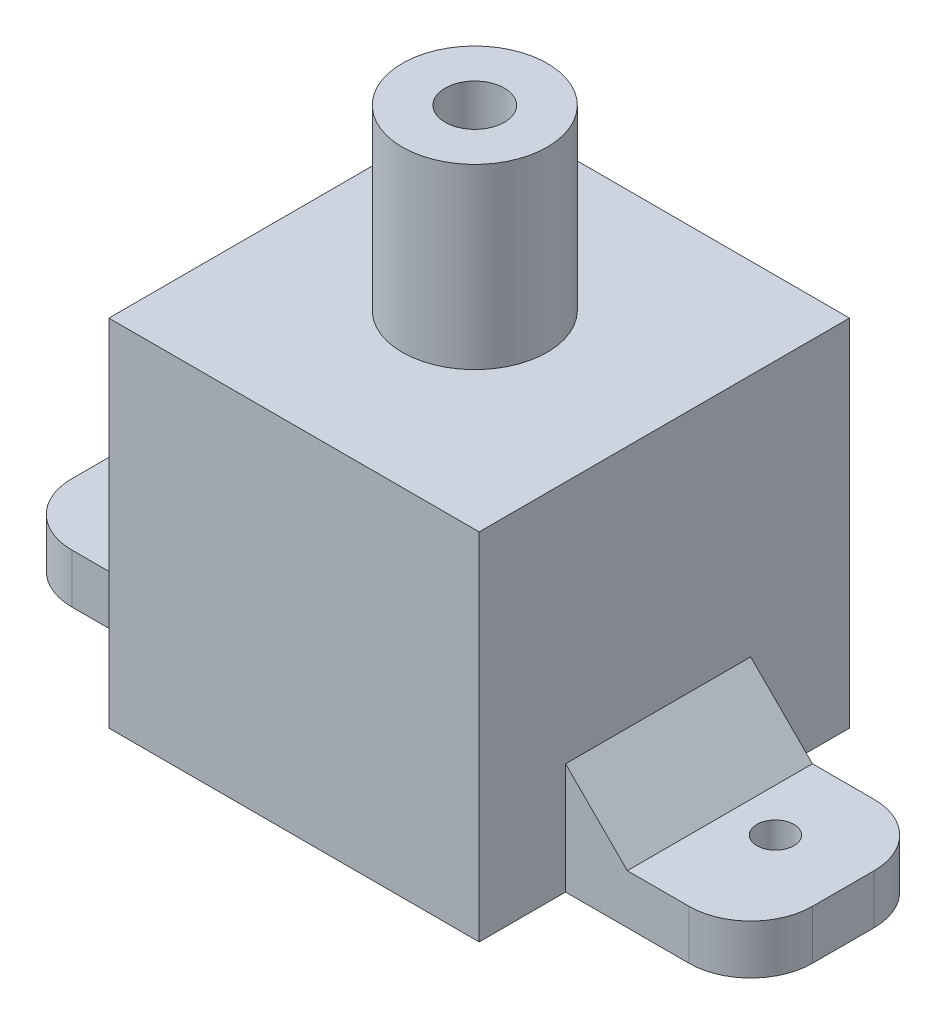
ISO-10303-21;
HEADER;
FILE_DESCRIPTION(('STEP AP214'),'2;1');
FILE_NAME('part.step','',(''),(''),'','','');
FILE_SCHEMA(('AUTOMOTIVE_DESIGN { 1 0 10303 214 1 1 1 1 }'));
ENDSEC;
DATA;
#1=APPLICATION_CONTEXT('core data for automotive mechanical design processes');
#2=APPLICATION_PROTOCOL_DEFINITION('international standard','automotive_design',2000,#1);
#3=PRODUCT_CONTEXT('',#1,'mechanical');
#4=PRODUCT('Part','Part','',(#3));
#5=PRODUCT_RELATED_PRODUCT_CATEGORY('part','',(#4));
#6=PRODUCT_DEFINITION_FORMATION('','',#4);
#7=PRODUCT_DEFINITION_CONTEXT('part definition',#1,'design');
#8=PRODUCT_DEFINITION('design','',#6,#7);
#9=PRODUCT_DEFINITION_SHAPE('','',#8);
#10=(LENGTH_UNIT() NAMED_UNIT(*) SI_UNIT(.MILLI.,.METRE.));
#11=(NAMED_UNIT(*) PLANE_ANGLE_UNIT() SI_UNIT($,.RADIAN.));
#12=(NAMED_UNIT(*) SI_UNIT($,.STERADIAN.) SOLID_ANGLE_UNIT());
#13=UNCERTAINTY_MEASURE_WITH_UNIT(LENGTH_MEASURE(1.E-05),#10,'distance_accuracy_value','');
#14=(GEOMETRIC_REPRESENTATION_CONTEXT(3) GLOBAL_UNCERTAINTY_ASSIGNED_CONTEXT((#13)) GLOBAL_UNIT_ASSIGNED_CONTEXT((#10,
#11,#12)) REPRESENTATION_CONTEXT('',''));
#15=CARTESIAN_POINT('',(0.,0.,0.));
#16=DIRECTION('',(0.,0.,1.));
#17=DIRECTION('',(1.,0.,0.));
#18=AXIS2_PLACEMENT_3D('',#15,#16,#17);
#19=CARTESIAN_POINT('',(-14.2865305436927,28.77,-14.6432652718463));
#20=DIRECTION('',(1.,0.,0.));
#21=DIRECTION('',(0.,0.,-1.));
#22=AXIS2_PLACEMENT_3D('',#19,#20,#21);
#23=PLANE('',#22);
#24=DIRECTION('',(0.,0.,1.));
#25=VECTOR('',#24,1.);
#26=CARTESIAN_POINT('',(-14.2865305436927,9.00000000000004,-14.6432652718463));
#27=LINE('',#26,#25);
#28=CARTESIAN_POINT('',(-14.2865305436927,9.00000000000004,-6.64326527184634));
#29=VERTEX_POINT('',#28);
#30=CARTESIAN_POINT('',(-14.2865305436927,9.00000000000004,8.35673472815366));
#31=VERTEX_POINT('',#30);
#32=EDGE_CURVE('E378',#29,#31,#27,.T.);
#33=ORIENTED_EDGE('',*,*,#32,.T.);
#34=DIRECTION('',(0.,-1.,0.));
#35=VECTOR('',#34,1.);
#36=CARTESIAN_POINT('',(-14.2865305436927,4.,8.35673472815366));
#37=LINE('',#36,#35);
#38=CARTESIAN_POINT('',(-14.2865305436927,0.,8.35673472815366));
#39=VERTEX_POINT('',#38);
#40=EDGE_CURVE('E248',#31,#39,#37,.T.);
#41=ORIENTED_EDGE('',*,*,#40,.T.);
#42=DIRECTION('',(0.,0.,1.));
#43=VECTOR('',#42,1.);
#44=CARTESIAN_POINT('',(-14.2865305436927,0.,-14.6432652718463));
#45=LINE('',#44,#43);
#46=CARTESIAN_POINT('',(-14.2865305436927,0.,15.3567347281537));
#47=VERTEX_POINT('',#46);
#48=EDGE_CURVE('E308',#39,#47,#45,.T.);
#49=ORIENTED_EDGE('',*,*,#48,.T.);
#50=DIRECTION('',(0.,-1.,0.));
#51=VECTOR('',#50,1.);
#52=CARTESIAN_POINT('',(-14.2865305436927,28.77,15.3567347281537));
#53=LINE('',#52,#51);
#54=CARTESIAN_POINT('',(-14.2865305436927,28.77,15.3567347281537));
#55=VERTEX_POINT('',#54);
#56=EDGE_CURVE('E314',#55,#47,#53,.T.);
#57=ORIENTED_EDGE('',*,*,#56,.F.);
#58=DIRECTION('',(0.,0.,1.));
#59=VECTOR('',#58,1.);
#60=CARTESIAN_POINT('',(-14.2865305436927,28.77,-14.6432652718463));
#61=LINE('',#60,#59);
#62=CARTESIAN_POINT('',(-14.2865305436927,28.77,-14.6432652718463));
#63=VERTEX_POINT('',#62);
#64=EDGE_CURVE('E315',#63,#55,#61,.T.);
#65=ORIENTED_EDGE('',*,*,#64,.F.);
#66=DIRECTION('',(0.,-1.,0.));
#67=VECTOR('',#66,1.);
#68=CARTESIAN_POINT('',(-14.2865305436927,28.77,-14.6432652718463));
#69=LINE('',#68,#67);
#70=CARTESIAN_POINT('',(-14.2865305436927,0.,-14.6432652718463));
#71=VERTEX_POINT('',#70);
#72=EDGE_CURVE('E329',#63,#71,#69,.T.);
#73=ORIENTED_EDGE('',*,*,#72,.T.);
#74=CARTESIAN_POINT('',(-14.2865305436927,0.,-6.64326527184634));
#75=VERTEX_POINT('',#74);
#76=EDGE_CURVE('E330',#71,#75,#45,.T.);
#77=ORIENTED_EDGE('',*,*,#76,.T.);
#78=DIRECTION('',(0.,-1.,0.));
#79=VECTOR('',#78,1.);
#80=CARTESIAN_POINT('',(-14.2865305436927,4.,-6.64326527184634));
#81=LINE('',#80,#79);
#82=EDGE_CURVE('E265',#29,#75,#81,.T.);
#83=ORIENTED_EDGE('',*,*,#82,.F.);
#84=EDGE_LOOP('',(#33,#41,#49,#57,#65,#73,#77,#83));
#85=FACE_BOUND('',#84,.T.);
#86=ADVANCED_FACE('F47',(#85),#23,.F.);
#87=CARTESIAN_POINT('',(15.7134694563073,28.77,-14.6432652718463));
#88=DIRECTION('',(-1.,0.,0.));
#89=DIRECTION('',(0.,0.,1.));
#90=AXIS2_PLACEMENT_3D('',#87,#88,#89);
#91=PLANE('',#90);
#92=DIRECTION('',(0.,0.,-1.));
#93=VECTOR('',#92,1.);
#94=CARTESIAN_POINT('',(15.7134694563073,9.00000000000004,-14.6432652718463));
#95=LINE('',#94,#93);
#96=CARTESIAN_POINT('',(15.7134694563073,9.00000000000004,8.35673472815366));
#97=VERTEX_POINT('',#96);
#98=CARTESIAN_POINT('',(15.7134694563073,9.00000000000004,-6.64326527184634));
#99=VERTEX_POINT('',#98);
#100=EDGE_CURVE('E313',#97,#99,#95,.T.);
#101=ORIENTED_EDGE('',*,*,#100,.T.);
#102=DIRECTION('',(0.,-1.,0.));
#103=VECTOR('',#102,1.);
#104=CARTESIAN_POINT('',(15.7134694563073,4.,-6.64326527184634));
#105=LINE('',#104,#103);
#106=CARTESIAN_POINT('',(15.7134694563073,0.,-6.64326527184634));
#107=VERTEX_POINT('',#106);
#108=EDGE_CURVE('E195',#99,#107,#105,.T.);
#109=ORIENTED_EDGE('',*,*,#108,.T.);
#110=DIRECTION('',(0.,0.,-1.));
#111=VECTOR('',#110,1.);
#112=CARTESIAN_POINT('',(15.7134694563073,0.,-14.6432652718463));
#113=LINE('',#112,#111);
#114=CARTESIAN_POINT('',(15.7134694563073,0.,-14.6432652718463));
#115=VERTEX_POINT('',#114);
#116=EDGE_CURVE('E337',#107,#115,#113,.T.);
#117=ORIENTED_EDGE('',*,*,#116,.T.);
#118=DIRECTION('',(0.,-1.,0.));
#119=VECTOR('',#118,1.);
#120=CARTESIAN_POINT('',(15.7134694563073,28.77,-14.6432652718463));
#121=LINE('',#120,#119);
#122=CARTESIAN_POINT('',(15.7134694563073,28.77,-14.6432652718463));
#123=VERTEX_POINT('',#122);
#124=EDGE_CURVE('E347',#123,#115,#121,.T.);
#125=ORIENTED_EDGE('',*,*,#124,.F.);
#126=DIRECTION('',(0.,0.,-1.));
#127=VECTOR('',#126,1.);
#128=CARTESIAN_POINT('',(15.7134694563073,28.77,-14.6432652718463));
#129=LINE('',#128,#127);
#130=CARTESIAN_POINT('',(15.7134694563073,28.77,15.3567347281537));
#131=VERTEX_POINT('',#130);
#132=EDGE_CURVE('E323',#131,#123,#129,.T.);
#133=ORIENTED_EDGE('',*,*,#132,.F.);
#134=DIRECTION('',(0.,-1.,0.));
#135=VECTOR('',#134,1.);
#136=CARTESIAN_POINT('',(15.7134694563073,28.77,15.3567347281537));
#137=LINE('',#136,#135);
#138=CARTESIAN_POINT('',(15.7134694563073,0.,15.3567347281537));
#139=VERTEX_POINT('',#138);
#140=EDGE_CURVE('E351',#131,#139,#137,.T.);
#141=ORIENTED_EDGE('',*,*,#140,.T.);
#142=CARTESIAN_POINT('',(15.7134694563073,0.,8.35673472815366));
#143=VERTEX_POINT('',#142);
#144=EDGE_CURVE('E338',#139,#143,#113,.T.);
#145=ORIENTED_EDGE('',*,*,#144,.T.);
#146=DIRECTION('',(0.,-1.,0.));
#147=VECTOR('',#146,1.);
#148=CARTESIAN_POINT('',(15.7134694563073,4.,8.35673472815366));
#149=LINE('',#148,#147);
#150=EDGE_CURVE('E233',#97,#143,#149,.T.);
#151=ORIENTED_EDGE('',*,*,#150,.F.);
#152=EDGE_LOOP('',(#101,#109,#117,#125,#133,#141,#145,#151));
#153=FACE_BOUND('',#152,.T.);
#154=ADVANCED_FACE('F428',(#153),#91,.F.);
#155=CARTESIAN_POINT('',(-14.2865305436927,28.77,15.3567347281537));
#156=DIRECTION('',(0.,0.,-1.));
#157=DIRECTION('',(-1.,0.,0.));
#158=AXIS2_PLACEMENT_3D('',#155,#156,#157);
#159=PLANE('',#158);
#160=DIRECTION('',(1.,0.,0.));
#161=VECTOR('',#160,1.);
#162=CARTESIAN_POINT('',(-14.2865305436927,0.,15.3567347281537));
#163=LINE('',#162,#161);
#164=EDGE_CURVE('E334',#47,#139,#163,.T.);
#165=ORIENTED_EDGE('',*,*,#164,.T.);
#166=ORIENTED_EDGE('',*,*,#140,.F.);
#167=DIRECTION('',(1.,0.,0.));
#168=VECTOR('',#167,1.);
#169=CARTESIAN_POINT('',(-14.2865305436927,28.77,15.3567347281537));
#170=LINE('',#169,#168);
#171=EDGE_CURVE('E319',#55,#131,#170,.T.);
#172=ORIENTED_EDGE('',*,*,#171,.F.);
#173=ORIENTED_EDGE('',*,*,#56,.T.);
#174=EDGE_LOOP('',(#165,#166,#172,#173));
#175=FACE_BOUND('',#174,.T.);
#176=ADVANCED_FACE('F397',(#175),#159,.F.);
#177=CARTESIAN_POINT('',(-14.2865305436927,28.77,-14.6432652718463));
#178=DIRECTION('',(0.,0.,1.));
#179=DIRECTION('',(1.,0.,0.));
#180=AXIS2_PLACEMENT_3D('',#177,#178,#179);
#181=PLANE('',#180);
#182=DIRECTION('',(-1.,0.,0.));
#183=VECTOR('',#182,1.);
#184=CARTESIAN_POINT('',(-14.2865305436927,0.,-14.6432652718463));
#185=LINE('',#184,#183);
#186=EDGE_CURVE('E320',#115,#71,#185,.T.);
#187=ORIENTED_EDGE('',*,*,#186,.T.);
#188=ORIENTED_EDGE('',*,*,#72,.F.);
#189=DIRECTION('',(-1.,0.,0.));
#190=VECTOR('',#189,1.);
#191=CARTESIAN_POINT('',(-14.2865305436927,28.77,-14.6432652718463));
#192=LINE('',#191,#190);
#193=EDGE_CURVE('E326',#123,#63,#192,.T.);
#194=ORIENTED_EDGE('',*,*,#193,.F.);
#195=ORIENTED_EDGE('',*,*,#124,.T.);
#196=EDGE_LOOP('',(#187,#188,#194,#195));
#197=FACE_BOUND('',#196,.T.);
#198=ADVANCED_FACE('F443',(#197),#181,.F.);
#199=CARTESIAN_POINT('',(0.,28.77,0.));
#200=DIRECTION('',(0.,1.,0.));
#201=DIRECTION('',(0.,0.,1.));
#202=AXIS2_PLACEMENT_3D('',#199,#200,#201);
#203=PLANE('',#202);
#204=CARTESIAN_POINT('',(0.,28.77,0.));
#205=DIRECTION('',(0.,1.,0.));
#206=DIRECTION('',(0.,0.,1.));
#207=AXIS2_PLACEMENT_3D('',#204,#205,#206);
#208=CIRCLE('',#207,5.875);
#209=CARTESIAN_POINT('',(0.,28.77,5.875));
#210=VERTEX_POINT('',#209);
#211=EDGE_CURVE('E309',#210,#210,#208,.T.);
#212=ORIENTED_EDGE('',*,*,#211,.F.);
#213=EDGE_LOOP('',(#212));
#214=FACE_BOUND('',#213,.T.);
#215=ORIENTED_EDGE('',*,*,#64,.T.);
#216=ORIENTED_EDGE('',*,*,#171,.T.);
#217=ORIENTED_EDGE('',*,*,#132,.T.);
#218=ORIENTED_EDGE('',*,*,#193,.T.);
#219=EDGE_LOOP('',(#215,#216,#217,#218));
#220=FACE_BOUND('',#219,.T.);
#221=ADVANCED_FACE('F400',(#214,#220),#203,.T.);
#222=CARTESIAN_POINT('',(0.,0.,0.));
#223=DIRECTION('',(0.,1.,0.));
#224=DIRECTION('',(0.,0.,1.));
#225=AXIS2_PLACEMENT_3D('',#222,#223,#224);
#226=PLANE('',#225);
#227=CARTESIAN_POINT('',(-22.7865305436927,0.,-0.143265271846341));
#228=DIRECTION('',(0.,1.,0.));
#229=DIRECTION('',(0.,0.,1.));
#230=AXIS2_PLACEMENT_3D('',#227,#228,#229);
#231=CIRCLE('',#230,1.5);
#232=CARTESIAN_POINT('',(-22.7865305436927,0.,1.35673472815366));
#233=VERTEX_POINT('',#232);
#234=EDGE_CURVE('E362',#233,#233,#231,.T.);
#235=ORIENTED_EDGE('',*,*,#234,.T.);
#236=EDGE_LOOP('',(#235));
#237=FACE_BOUND('',#236,.T.);
#238=CARTESIAN_POINT('',(24.2134694563074,0.,-0.143265271846338));
#239=DIRECTION('',(0.,1.,0.));
#240=DIRECTION('',(0.,0.,1.));
#241=AXIS2_PLACEMENT_3D('',#238,#239,#240);
#242=CIRCLE('',#241,1.5);
#243=CARTESIAN_POINT('',(24.2134694563074,0.,1.35673472815366));
#244=VERTEX_POINT('',#243);
#245=EDGE_CURVE('E513',#244,#244,#242,.T.);
#246=ORIENTED_EDGE('',*,*,#245,.T.);
#247=EDGE_LOOP('',(#246));
#248=FACE_BOUND('',#247,.T.);
#249=ORIENTED_EDGE('',*,*,#76,.F.);
#250=ORIENTED_EDGE('',*,*,#186,.F.);
#251=ORIENTED_EDGE('',*,*,#116,.F.);
#252=DIRECTION('',(1.,0.,0.));
#253=VECTOR('',#252,1.);
#254=CARTESIAN_POINT('',(15.7134694563073,0.,-6.64326527184634));
#255=LINE('',#254,#253);
#256=CARTESIAN_POINT('',(25.7134694563073,0.,-6.64326527184634));
#257=VERTEX_POINT('',#256);
#258=EDGE_CURVE('E216',#107,#257,#255,.T.);
#259=ORIENTED_EDGE('',*,*,#258,.T.);
#260=CARTESIAN_POINT('',(25.7134694563073,0.,-1.64326527184634));
#261=DIRECTION('',(0.,-1.,0.));
#262=DIRECTION('',(0.,0.,1.));
#263=AXIS2_PLACEMENT_3D('',#260,#261,#262);
#264=CIRCLE('',#263,5.);
#265=CARTESIAN_POINT('',(30.7134694563074,0.,-1.6432652718463));
#266=VERTEX_POINT('',#265);
#267=EDGE_CURVE('E191',#257,#266,#264,.T.);
#268=ORIENTED_EDGE('',*,*,#267,.T.);
#269=DIRECTION('',(0.,0.,1.));
#270=VECTOR('',#269,1.);
#271=CARTESIAN_POINT('',(30.7134694563074,0.,3.35673472815363));
#272=LINE('',#271,#270);
#273=CARTESIAN_POINT('',(30.7134694563074,0.,3.35673472815363));
#274=VERTEX_POINT('',#273);
#275=EDGE_CURVE('E222',#266,#274,#272,.T.);
#276=ORIENTED_EDGE('',*,*,#275,.T.);
#277=CARTESIAN_POINT('',(25.7134694563073,0.,3.35673472815366));
#278=DIRECTION('',(0.,-1.,0.));
#279=DIRECTION('',(0.,0.,-1.));
#280=AXIS2_PLACEMENT_3D('',#277,#278,#279);
#281=CIRCLE('',#280,5.);
#282=CARTESIAN_POINT('',(25.7134694563073,0.,8.35673472815366));
#283=VERTEX_POINT('',#282);
#284=EDGE_CURVE('E226',#274,#283,#281,.T.);
#285=ORIENTED_EDGE('',*,*,#284,.T.);
#286=DIRECTION('',(-1.,0.,0.));
#287=VECTOR('',#286,1.);
#288=CARTESIAN_POINT('',(15.7134694563073,0.,8.35673472815366));
#289=LINE('',#288,#287);
#290=EDGE_CURVE('E185',#283,#143,#289,.T.);
#291=ORIENTED_EDGE('',*,*,#290,.T.);
#292=ORIENTED_EDGE('',*,*,#144,.F.);
#293=ORIENTED_EDGE('',*,*,#164,.F.);
#294=ORIENTED_EDGE('',*,*,#48,.F.);
#295=DIRECTION('',(-1.,0.,0.));
#296=VECTOR('',#295,1.);
#297=CARTESIAN_POINT('',(-14.2865305436927,0.,8.35673472815366));
#298=LINE('',#297,#296);
#299=CARTESIAN_POINT('',(-24.2865305436926,0.,8.35673472815366));
#300=VERTEX_POINT('',#299);
#301=EDGE_CURVE('E219',#39,#300,#298,.T.);
#302=ORIENTED_EDGE('',*,*,#301,.T.);
#303=CARTESIAN_POINT('',(-24.2865305436927,0.,3.35673472815366));
#304=DIRECTION('',(0.,-1.,0.));
#305=DIRECTION('',(0.,0.,1.));
#306=AXIS2_PLACEMENT_3D('',#303,#304,#305);
#307=CIRCLE('',#306,5.);
#308=CARTESIAN_POINT('',(-29.2865305436927,0.,3.35673472815363));
#309=VERTEX_POINT('',#308);
#310=EDGE_CURVE('E282',#300,#309,#307,.T.);
#311=ORIENTED_EDGE('',*,*,#310,.T.);
#312=DIRECTION('',(0.,0.,-1.));
#313=VECTOR('',#312,1.);
#314=CARTESIAN_POINT('',(-29.2865305436927,0.,3.35673472815362));
#315=LINE('',#314,#313);
#316=CARTESIAN_POINT('',(-29.2865305436927,0.,-1.64326527184631));
#317=VERTEX_POINT('',#316);
#318=EDGE_CURVE('E278',#309,#317,#315,.T.);
#319=ORIENTED_EDGE('',*,*,#318,.T.);
#320=CARTESIAN_POINT('',(-24.2865305436927,0.,-1.64326527184634));
#321=DIRECTION('',(0.,-1.,0.));
#322=DIRECTION('',(0.,0.,1.));
#323=AXIS2_PLACEMENT_3D('',#320,#321,#322);
#324=CIRCLE('',#323,5.);
#325=CARTESIAN_POINT('',(-24.2865305436926,0.,-6.64326527184634));
#326=VERTEX_POINT('',#325);
#327=EDGE_CURVE('E273',#317,#326,#324,.T.);
#328=ORIENTED_EDGE('',*,*,#327,.T.);
#329=DIRECTION('',(1.,0.,0.));
#330=VECTOR('',#329,1.);
#331=CARTESIAN_POINT('',(-14.2865305436927,0.,-6.64326527184634));
#332=LINE('',#331,#330);
#333=EDGE_CURVE('E269',#326,#75,#332,.T.);
#334=ORIENTED_EDGE('',*,*,#333,.T.);
#335=EDGE_LOOP('',(#249,#250,#251,#259,#268,#276,#285,#291,#292,#293,#294,#302,#311,#319,#328,#334));
#336=FACE_BOUND('',#335,.T.);
#337=ADVANCED_FACE('F394',(#237,#248,#336),#226,.F.);
#338=CARTESIAN_POINT('',(0.,43.17,0.));
#339=DIRECTION('',(0.,-1.,0.));
#340=DIRECTION('',(0.,0.,-1.));
#341=AXIS2_PLACEMENT_3D('',#338,#339,#340);
#342=CYLINDRICAL_SURFACE('',#341,5.875);
#343=CARTESIAN_POINT('',(0.,43.17,0.));
#344=DIRECTION('',(0.,1.,0.));
#345=DIRECTION('',(0.,0.,1.));
#346=AXIS2_PLACEMENT_3D('',#343,#344,#345);
#347=CIRCLE('',#346,5.875);
#348=CARTESIAN_POINT('',(0.,43.17,5.875));
#349=VERTEX_POINT('',#348);
#350=EDGE_CURVE('E236',#349,#349,#347,.T.);
#351=ORIENTED_EDGE('',*,*,#350,.F.);
#352=EDGE_LOOP('',(#351));
#353=FACE_BOUND('',#352,.T.);
#354=ORIENTED_EDGE('',*,*,#211,.T.);
#355=EDGE_LOOP('',(#354));
#356=FACE_BOUND('',#355,.T.);
#357=ADVANCED_FACE('F449',(#353,#356),#342,.T.);
#358=CARTESIAN_POINT('',(0.,43.17,0.));
#359=DIRECTION('',(0.,1.,0.));
#360=DIRECTION('',(0.,0.,1.));
#361=AXIS2_PLACEMENT_3D('',#358,#359,#360);
#362=PLANE('',#361);
#363=CARTESIAN_POINT('',(0.,43.17,0.));
#364=DIRECTION('',(0.,1.,0.));
#365=DIRECTION('',(0.,0.,1.));
#366=AXIS2_PLACEMENT_3D('',#363,#364,#365);
#367=CIRCLE('',#366,2.4);
#368=CARTESIAN_POINT('',(0.,43.17,2.4));
#369=VERTEX_POINT('',#368);
#370=EDGE_CURVE('E514',#369,#369,#367,.T.);
#371=ORIENTED_EDGE('',*,*,#370,.F.);
#372=EDGE_LOOP('',(#371));
#373=FACE_BOUND('',#372,.T.);
#374=ORIENTED_EDGE('',*,*,#350,.T.);
#375=EDGE_LOOP('',(#374));
#376=FACE_BOUND('',#375,.T.);
#377=ADVANCED_FACE('F456',(#373,#376),#362,.T.);
#378=CARTESIAN_POINT('',(15.7134694563073,4.,8.35673472815366));
#379=DIRECTION('',(0.,0.,1.));
#380=DIRECTION('',(1.,0.,0.));
#381=AXIS2_PLACEMENT_3D('',#378,#379,#380);
#382=PLANE('',#381);
#383=ORIENTED_EDGE('',*,*,#290,.F.);
#384=DIRECTION('',(0.,-1.,0.));
#385=VECTOR('',#384,1.);
#386=CARTESIAN_POINT('',(25.7134694563073,4.,8.35673472815366));
#387=LINE('',#386,#385);
#388=CARTESIAN_POINT('',(25.7134694563073,4.,8.35673472815366));
#389=VERTEX_POINT('',#388);
#390=EDGE_CURVE('E237',#389,#283,#387,.T.);
#391=ORIENTED_EDGE('',*,*,#390,.F.);
#392=DIRECTION('',(-1.,0.,0.));
#393=VECTOR('',#392,1.);
#394=CARTESIAN_POINT('',(15.7134694563073,4.,8.35673472815366));
#395=LINE('',#394,#393);
#396=CARTESIAN_POINT('',(20.7134694563073,4.,8.35673472815366));
#397=VERTEX_POINT('',#396);
#398=EDGE_CURVE('E212',#389,#397,#395,.T.);
#399=ORIENTED_EDGE('',*,*,#398,.T.);
#400=DIRECTION('',(-0.707106781186543,0.707106781186552,0.));
#401=VECTOR('',#400,1.);
#402=CARTESIAN_POINT('',(15.7134694563073,9.00000000000004,8.35673472815366));
#403=LINE('',#402,#401);
#404=EDGE_CURVE('E374',#397,#97,#403,.T.);
#405=ORIENTED_EDGE('',*,*,#404,.T.);
#406=ORIENTED_EDGE('',*,*,#150,.T.);
#407=EDGE_LOOP('',(#383,#391,#399,#405,#406));
#408=FACE_BOUND('',#407,.T.);
#409=ADVANCED_FACE('F459',(#408),#382,.T.);
#410=CARTESIAN_POINT('',(25.7134694563073,4.,3.35673472815366));
#411=DIRECTION('',(0.,-1.,0.));
#412=DIRECTION('',(0.,0.,-1.));
#413=AXIS2_PLACEMENT_3D('',#410,#411,#412);
#414=CYLINDRICAL_SURFACE('',#413,5.);
#415=ORIENTED_EDGE('',*,*,#284,.F.);
#416=DIRECTION('',(0.,-1.,0.));
#417=VECTOR('',#416,1.);
#418=CARTESIAN_POINT('',(30.7134694563074,4.,3.35673472815363));
#419=LINE('',#418,#417);
#420=CARTESIAN_POINT('',(30.7134694563074,4.,3.35673472815363));
#421=VERTEX_POINT('',#420);
#422=EDGE_CURVE('E240',#421,#274,#419,.T.);
#423=ORIENTED_EDGE('',*,*,#422,.F.);
#424=CARTESIAN_POINT('',(25.7134694563073,4.,3.35673472815366));
#425=DIRECTION('',(0.,-1.,0.));
#426=DIRECTION('',(0.,0.,-1.));
#427=AXIS2_PLACEMENT_3D('',#424,#425,#426);
#428=CIRCLE('',#427,5.);
#429=EDGE_CURVE('E205',#421,#389,#428,.T.);
#430=ORIENTED_EDGE('',*,*,#429,.T.);
#431=ORIENTED_EDGE('',*,*,#390,.T.);
#432=EDGE_LOOP('',(#415,#423,#430,#431));
#433=FACE_BOUND('',#432,.T.);
#434=ADVANCED_FACE('F488',(#433),#414,.T.);
#435=CARTESIAN_POINT('',(30.7134694563074,4.,3.35673472815363));
#436=DIRECTION('',(1.,0.,0.));
#437=DIRECTION('',(0.,0.,-1.));
#438=AXIS2_PLACEMENT_3D('',#435,#436,#437);
#439=PLANE('',#438);
#440=ORIENTED_EDGE('',*,*,#275,.F.);
#441=DIRECTION('',(0.,-1.,0.));
#442=VECTOR('',#441,1.);
#443=CARTESIAN_POINT('',(30.7134694563074,4.,-1.6432652718463));
#444=LINE('',#443,#442);
#445=CARTESIAN_POINT('',(30.7134694563074,4.,-1.6432652718463));
#446=VERTEX_POINT('',#445);
#447=EDGE_CURVE('E194',#446,#266,#444,.T.);
#448=ORIENTED_EDGE('',*,*,#447,.F.);
#449=DIRECTION('',(0.,0.,1.));
#450=VECTOR('',#449,1.);
#451=CARTESIAN_POINT('',(30.7134694563074,4.,3.35673472815363));
#452=LINE('',#451,#450);
#453=EDGE_CURVE('E201',#446,#421,#452,.T.);
#454=ORIENTED_EDGE('',*,*,#453,.T.);
#455=ORIENTED_EDGE('',*,*,#422,.T.);
#456=EDGE_LOOP('',(#440,#448,#454,#455));
#457=FACE_BOUND('',#456,.T.);
#458=ADVANCED_FACE('F485',(#457),#439,.T.);
#459=CARTESIAN_POINT('',(25.7134694563073,4.,-1.64326527184634));
#460=DIRECTION('',(0.,-1.,0.));
#461=DIRECTION('',(0.,0.,-1.));
#462=AXIS2_PLACEMENT_3D('',#459,#460,#461);
#463=CYLINDRICAL_SURFACE('',#462,5.);
#464=ORIENTED_EDGE('',*,*,#267,.F.);
#465=DIRECTION('',(0.,-1.,0.));
#466=VECTOR('',#465,1.);
#467=CARTESIAN_POINT('',(25.7134694563073,4.,-6.64326527184634));
#468=LINE('',#467,#466);
#469=CARTESIAN_POINT('',(25.7134694563073,4.,-6.64326527184634));
#470=VERTEX_POINT('',#469);
#471=EDGE_CURVE('E176',#470,#257,#468,.T.);
#472=ORIENTED_EDGE('',*,*,#471,.F.);
#473=CARTESIAN_POINT('',(25.7134694563073,4.,-1.64326527184634));
#474=DIRECTION('',(0.,-1.,0.));
#475=DIRECTION('',(0.,0.,1.));
#476=AXIS2_PLACEMENT_3D('',#473,#474,#475);
#477=CIRCLE('',#476,5.);
#478=EDGE_CURVE('E184',#470,#446,#477,.T.);
#479=ORIENTED_EDGE('',*,*,#478,.T.);
#480=ORIENTED_EDGE('',*,*,#447,.T.);
#481=EDGE_LOOP('',(#464,#472,#479,#480));
#482=FACE_BOUND('',#481,.T.);
#483=ADVANCED_FACE('F189',(#482),#463,.T.);
#484=CARTESIAN_POINT('',(15.7134694563073,4.,-6.64326527184634));
#485=DIRECTION('',(0.,0.,-1.));
#486=DIRECTION('',(-1.,0.,0.));
#487=AXIS2_PLACEMENT_3D('',#484,#485,#486);
#488=PLANE('',#487);
#489=ORIENTED_EDGE('',*,*,#258,.F.);
#490=ORIENTED_EDGE('',*,*,#108,.F.);
#491=DIRECTION('',(0.707106781186543,-0.707106781186552,0.));
#492=VECTOR('',#491,1.);
#493=CARTESIAN_POINT('',(15.7134694563073,9.00000000000004,-6.64326527184634));
#494=LINE('',#493,#492);
#495=CARTESIAN_POINT('',(20.7134694563073,4.,-6.64326527184634));
#496=VERTEX_POINT('',#495);
#497=EDGE_CURVE('E179',#99,#496,#494,.T.);
#498=ORIENTED_EDGE('',*,*,#497,.T.);
#499=DIRECTION('',(1.,0.,0.));
#500=VECTOR('',#499,1.);
#501=CARTESIAN_POINT('',(15.7134694563073,4.,-6.64326527184634));
#502=LINE('',#501,#500);
#503=EDGE_CURVE('E173',#496,#470,#502,.T.);
#504=ORIENTED_EDGE('',*,*,#503,.T.);
#505=ORIENTED_EDGE('',*,*,#471,.T.);
#506=EDGE_LOOP('',(#489,#490,#498,#504,#505));
#507=FACE_BOUND('',#506,.T.);
#508=ADVANCED_FACE('F175',(#507),#488,.T.);
#509=CARTESIAN_POINT('',(25.7134694563073,4.,-1.64326527184634));
#510=DIRECTION('',(0.,1.,0.));
#511=DIRECTION('',(0.,0.,1.));
#512=AXIS2_PLACEMENT_3D('',#509,#510,#511);
#513=PLANE('',#512);
#514=CARTESIAN_POINT('',(24.2134694563074,4.,-0.143265271846338));
#515=DIRECTION('',(0.,1.,0.));
#516=DIRECTION('',(0.,0.,1.));
#517=AXIS2_PLACEMENT_3D('',#514,#515,#516);
#518=CIRCLE('',#517,1.5);
#519=CARTESIAN_POINT('',(24.2134694563074,4.,1.35673472815366));
#520=VERTEX_POINT('',#519);
#521=EDGE_CURVE('E268',#520,#520,#518,.T.);
#522=ORIENTED_EDGE('',*,*,#521,.F.);
#523=EDGE_LOOP('',(#522));
#524=FACE_BOUND('',#523,.T.);
#525=ORIENTED_EDGE('',*,*,#503,.F.);
#526=DIRECTION('',(0.,0.,1.));
#527=VECTOR('',#526,1.);
#528=CARTESIAN_POINT('',(20.7134694563073,4.,-1.64326527184634));
#529=LINE('',#528,#527);
#530=EDGE_CURVE('E369',#496,#397,#529,.T.);
#531=ORIENTED_EDGE('',*,*,#530,.T.);
#532=ORIENTED_EDGE('',*,*,#398,.F.);
#533=ORIENTED_EDGE('',*,*,#429,.F.);
#534=ORIENTED_EDGE('',*,*,#453,.F.);
#535=ORIENTED_EDGE('',*,*,#478,.F.);
#536=EDGE_LOOP('',(#525,#531,#532,#533,#534,#535));
#537=FACE_BOUND('',#536,.T.);
#538=ADVANCED_FACE('F198',(#524,#537),#513,.T.);
#539=CARTESIAN_POINT('',(-14.2865305436927,4.,-6.64326527184634));
#540=DIRECTION('',(0.,0.,-1.));
#541=DIRECTION('',(-1.,0.,0.));
#542=AXIS2_PLACEMENT_3D('',#539,#540,#541);
#543=PLANE('',#542);
#544=ORIENTED_EDGE('',*,*,#333,.F.);
#545=DIRECTION('',(0.,-1.,0.));
#546=VECTOR('',#545,1.);
#547=CARTESIAN_POINT('',(-24.2865305436926,4.,-6.64326527184634));
#548=LINE('',#547,#546);
#549=CARTESIAN_POINT('',(-24.2865305436926,4.,-6.64326527184634));
#550=VERTEX_POINT('',#549);
#551=EDGE_CURVE('E262',#550,#326,#548,.T.);
#552=ORIENTED_EDGE('',*,*,#551,.F.);
#553=DIRECTION('',(1.,0.,0.));
#554=VECTOR('',#553,1.);
#555=CARTESIAN_POINT('',(-14.2865305436927,4.,-6.64326527184634));
#556=LINE('',#555,#554);
#557=CARTESIAN_POINT('',(-19.2865305436926,4.,-6.64326527184634));
#558=VERTEX_POINT('',#557);
#559=EDGE_CURVE('E252',#550,#558,#556,.T.);
#560=ORIENTED_EDGE('',*,*,#559,.T.);
#561=DIRECTION('',(0.707106781186544,0.707106781186551,0.));
#562=VECTOR('',#561,1.);
#563=CARTESIAN_POINT('',(-14.2865305436927,9.00000000000004,-6.64326527184634));
#564=LINE('',#563,#562);
#565=EDGE_CURVE('E11',#558,#29,#564,.T.);
#566=ORIENTED_EDGE('',*,*,#565,.T.);
#567=ORIENTED_EDGE('',*,*,#82,.T.);
#568=EDGE_LOOP('',(#544,#552,#560,#566,#567));
#569=FACE_BOUND('',#568,.T.);
#570=ADVANCED_FACE('F409',(#569),#543,.T.);
#571=CARTESIAN_POINT('',(-24.2865305436927,4.,-1.64326527184634));
#572=DIRECTION('',(0.,-1.,0.));
#573=DIRECTION('',(0.,0.,-1.));
#574=AXIS2_PLACEMENT_3D('',#571,#572,#573);
#575=CYLINDRICAL_SURFACE('',#574,5.);
#576=ORIENTED_EDGE('',*,*,#327,.F.);
#577=DIRECTION('',(0.,-1.,0.));
#578=VECTOR('',#577,1.);
#579=CARTESIAN_POINT('',(-29.2865305436927,4.,-1.64326527184631));
#580=LINE('',#579,#578);
#581=CARTESIAN_POINT('',(-29.2865305436927,4.,-1.64326527184631));
#582=VERTEX_POINT('',#581);
#583=EDGE_CURVE('E259',#582,#317,#580,.T.);
#584=ORIENTED_EDGE('',*,*,#583,.F.);
#585=CARTESIAN_POINT('',(-24.2865305436927,4.,-1.64326527184634));
#586=DIRECTION('',(0.,-1.,0.));
#587=DIRECTION('',(0.,0.,1.));
#588=AXIS2_PLACEMENT_3D('',#585,#586,#587);
#589=CIRCLE('',#588,5.);
#590=EDGE_CURVE('E291',#582,#550,#589,.T.);
#591=ORIENTED_EDGE('',*,*,#590,.T.);
#592=ORIENTED_EDGE('',*,*,#551,.T.);
#593=EDGE_LOOP('',(#576,#584,#591,#592));
#594=FACE_BOUND('',#593,.T.);
#595=ADVANCED_FACE('F467',(#594),#575,.T.);
#596=CARTESIAN_POINT('',(-29.2865305436927,4.,3.35673472815362));
#597=DIRECTION('',(-1.,0.,0.));
#598=DIRECTION('',(0.,0.,1.));
#599=AXIS2_PLACEMENT_3D('',#596,#597,#598);
#600=PLANE('',#599);
#601=ORIENTED_EDGE('',*,*,#318,.F.);
#602=DIRECTION('',(0.,-1.,0.));
#603=VECTOR('',#602,1.);
#604=CARTESIAN_POINT('',(-29.2865305436927,4.,3.35673472815363));
#605=LINE('',#604,#603);
#606=CARTESIAN_POINT('',(-29.2865305436927,4.,3.35673472815363));
#607=VERTEX_POINT('',#606);
#608=EDGE_CURVE('E256',#607,#309,#605,.T.);
#609=ORIENTED_EDGE('',*,*,#608,.F.);
#610=DIRECTION('',(0.,0.,-1.));
#611=VECTOR('',#610,1.);
#612=CARTESIAN_POINT('',(-29.2865305436927,4.,3.35673472815362));
#613=LINE('',#612,#611);
#614=EDGE_CURVE('E295',#607,#582,#613,.T.);
#615=ORIENTED_EDGE('',*,*,#614,.T.);
#616=ORIENTED_EDGE('',*,*,#583,.T.);
#617=EDGE_LOOP('',(#601,#609,#615,#616));
#618=FACE_BOUND('',#617,.T.);
#619=ADVANCED_FACE('F470',(#618),#600,.T.);
#620=CARTESIAN_POINT('',(-24.2865305436927,4.,3.35673472815366));
#621=DIRECTION('',(0.,-1.,0.));
#622=DIRECTION('',(0.,0.,-1.));
#623=AXIS2_PLACEMENT_3D('',#620,#621,#622);
#624=CYLINDRICAL_SURFACE('',#623,5.);
#625=ORIENTED_EDGE('',*,*,#310,.F.);
#626=DIRECTION('',(0.,-1.,0.));
#627=VECTOR('',#626,1.);
#628=CARTESIAN_POINT('',(-24.2865305436926,4.,8.35673472815366));
#629=LINE('',#628,#627);
#630=CARTESIAN_POINT('',(-24.2865305436926,4.,8.35673472815366));
#631=VERTEX_POINT('',#630);
#632=EDGE_CURVE('E253',#631,#300,#629,.T.);
#633=ORIENTED_EDGE('',*,*,#632,.F.);
#634=CARTESIAN_POINT('',(-24.2865305436927,4.,3.35673472815366));
#635=DIRECTION('',(0.,-1.,0.));
#636=DIRECTION('',(0.,0.,1.));
#637=AXIS2_PLACEMENT_3D('',#634,#635,#636);
#638=CIRCLE('',#637,5.);
#639=EDGE_CURVE('E299',#631,#607,#638,.T.);
#640=ORIENTED_EDGE('',*,*,#639,.T.);
#641=ORIENTED_EDGE('',*,*,#608,.T.);
#642=EDGE_LOOP('',(#625,#633,#640,#641));
#643=FACE_BOUND('',#642,.T.);
#644=ADVANCED_FACE('F474',(#643),#624,.T.);
#645=CARTESIAN_POINT('',(-14.2865305436927,4.,8.35673472815366));
#646=DIRECTION('',(0.,0.,1.));
#647=DIRECTION('',(1.,0.,0.));
#648=AXIS2_PLACEMENT_3D('',#645,#646,#647);
#649=PLANE('',#648);
#650=ORIENTED_EDGE('',*,*,#301,.F.);
#651=ORIENTED_EDGE('',*,*,#40,.F.);
#652=DIRECTION('',(-0.707106781186544,-0.707106781186551,0.));
#653=VECTOR('',#652,1.);
#654=CARTESIAN_POINT('',(-14.2865305436927,9.00000000000004,8.35673472815366));
#655=LINE('',#654,#653);
#656=CARTESIAN_POINT('',(-19.2865305436926,4.,8.35673472815366));
#657=VERTEX_POINT('',#656);
#658=EDGE_CURVE('E57',#31,#657,#655,.T.);
#659=ORIENTED_EDGE('',*,*,#658,.T.);
#660=DIRECTION('',(-1.,0.,0.));
#661=VECTOR('',#660,1.);
#662=CARTESIAN_POINT('',(-14.2865305436927,4.,8.35673472815366));
#663=LINE('',#662,#661);
#664=EDGE_CURVE('E274',#657,#631,#663,.T.);
#665=ORIENTED_EDGE('',*,*,#664,.T.);
#666=ORIENTED_EDGE('',*,*,#632,.T.);
#667=EDGE_LOOP('',(#650,#651,#659,#665,#666));
#668=FACE_BOUND('',#667,.T.);
#669=ADVANCED_FACE('F464',(#668),#649,.T.);
#670=CARTESIAN_POINT('',(-24.2865305436927,4.,-1.64326527184634));
#671=DIRECTION('',(0.,1.,0.));
#672=DIRECTION('',(0.,0.,1.));
#673=AXIS2_PLACEMENT_3D('',#670,#671,#672);
#674=PLANE('',#673);
#675=CARTESIAN_POINT('',(-22.7865305436927,4.,-0.143265271846341));
#676=DIRECTION('',(0.,1.,0.));
#677=DIRECTION('',(0.,0.,1.));
#678=AXIS2_PLACEMENT_3D('',#675,#676,#677);
#679=CIRCLE('',#678,1.5);
#680=CARTESIAN_POINT('',(-22.7865305436927,4.,1.35673472815366));
#681=VERTEX_POINT('',#680);
#682=EDGE_CURVE('E358',#681,#681,#679,.T.);
#683=ORIENTED_EDGE('',*,*,#682,.F.);
#684=EDGE_LOOP('',(#683));
#685=FACE_BOUND('',#684,.T.);
#686=ORIENTED_EDGE('',*,*,#664,.F.);
#687=DIRECTION('',(0.,0.,-1.));
#688=VECTOR('',#687,1.);
#689=CARTESIAN_POINT('',(-19.2865305436926,4.,-1.64326527184634));
#690=LINE('',#689,#688);
#691=EDGE_CURVE('E70',#657,#558,#690,.T.);
#692=ORIENTED_EDGE('',*,*,#691,.T.);
#693=ORIENTED_EDGE('',*,*,#559,.F.);
#694=ORIENTED_EDGE('',*,*,#590,.F.);
#695=ORIENTED_EDGE('',*,*,#614,.F.);
#696=ORIENTED_EDGE('',*,*,#639,.F.);
#697=EDGE_LOOP('',(#686,#692,#693,#694,#695,#696));
#698=FACE_BOUND('',#697,.T.);
#699=ADVANCED_FACE('F461',(#685,#698),#674,.T.);
#700=CARTESIAN_POINT('',(-22.7865305436927,0.,-0.143265271846341));
#701=DIRECTION('',(0.,1.,0.));
#702=DIRECTION('',(0.,0.,1.));
#703=AXIS2_PLACEMENT_3D('',#700,#701,#702);
#704=CYLINDRICAL_SURFACE('',#703,1.5);
#705=ORIENTED_EDGE('',*,*,#682,.T.);
#706=EDGE_LOOP('',(#705));
#707=FACE_BOUND('',#706,.T.);
#708=ORIENTED_EDGE('',*,*,#234,.F.);
#709=EDGE_LOOP('',(#708));
#710=FACE_BOUND('',#709,.T.);
#711=ADVANCED_FACE('F463',(#707,#710),#704,.F.);
#712=CARTESIAN_POINT('',(24.2134694563074,0.,-0.143265271846338));
#713=DIRECTION('',(0.,1.,0.));
#714=DIRECTION('',(0.,0.,1.));
#715=AXIS2_PLACEMENT_3D('',#712,#713,#714);
#716=CYLINDRICAL_SURFACE('',#715,1.5);
#717=ORIENTED_EDGE('',*,*,#521,.T.);
#718=EDGE_LOOP('',(#717));
#719=FACE_BOUND('',#718,.T.);
#720=ORIENTED_EDGE('',*,*,#245,.F.);
#721=EDGE_LOOP('',(#720));
#722=FACE_BOUND('',#721,.T.);
#723=ADVANCED_FACE('F425',(#719,#722),#716,.F.);
#724=CARTESIAN_POINT('',(15.7134694563073,9.00000000000004,-14.6432652718463));
#725=DIRECTION('',(-0.707106781186552,-0.707106781186543,0.));
#726=DIRECTION('',(0.,0.,-1.));
#727=AXIS2_PLACEMENT_3D('',#724,#725,#726);
#728=PLANE('',#727);
#729=ORIENTED_EDGE('',*,*,#404,.F.);
#730=ORIENTED_EDGE('',*,*,#530,.F.);
#731=ORIENTED_EDGE('',*,*,#497,.F.);
#732=ORIENTED_EDGE('',*,*,#100,.F.);
#733=EDGE_LOOP('',(#729,#730,#731,#732));
#734=FACE_BOUND('',#733,.T.);
#735=ADVANCED_FACE('F415',(#734),#728,.F.);
#736=CARTESIAN_POINT('',(-14.2865305436927,9.00000000000004,-14.6432652718463));
#737=DIRECTION('',(0.707106781186552,-0.707106781186544,0.));
#738=DIRECTION('',(0.,0.,1.));
#739=AXIS2_PLACEMENT_3D('',#736,#737,#738);
#740=PLANE('',#739);
#741=ORIENTED_EDGE('',*,*,#565,.F.);
#742=ORIENTED_EDGE('',*,*,#691,.F.);
#743=ORIENTED_EDGE('',*,*,#658,.F.);
#744=ORIENTED_EDGE('',*,*,#32,.F.);
#745=EDGE_LOOP('',(#741,#742,#743,#744));
#746=FACE_BOUND('',#745,.T.);
#747=ADVANCED_FACE('F50',(#746),#740,.F.);
#748=CARTESIAN_POINT('',(0.,35.17,0.));
#749=DIRECTION('',(0.,1.,0.));
#750=DIRECTION('',(0.,0.,1.));
#751=AXIS2_PLACEMENT_3D('',#748,#749,#750);
#752=CYLINDRICAL_SURFACE('',#751,2.4);
#753=CARTESIAN_POINT('',(0.,35.17,0.));
#754=DIRECTION('',(0.,1.,0.));
#755=DIRECTION('',(0.,0.,1.));
#756=AXIS2_PLACEMENT_3D('',#753,#754,#755);
#757=CIRCLE('',#756,2.4);
#758=CARTESIAN_POINT('',(0.,35.17,2.4));
#759=VERTEX_POINT('',#758);
#760=EDGE_CURVE('E511',#759,#759,#757,.T.);
#761=ORIENTED_EDGE('',*,*,#760,.F.);
#762=EDGE_LOOP('',(#761));
#763=FACE_BOUND('',#762,.T.);
#764=ORIENTED_EDGE('',*,*,#370,.T.);
#765=EDGE_LOOP('',(#764));
#766=FACE_BOUND('',#765,.T.);
#767=ADVANCED_FACE('F414',(#763,#766),#752,.F.);
#768=CARTESIAN_POINT('',(0.,35.17,0.));
#769=DIRECTION('',(0.,1.,0.));
#770=DIRECTION('',(0.,0.,1.));
#771=AXIS2_PLACEMENT_3D('',#768,#769,#770);
#772=PLANE('',#771);
#773=ORIENTED_EDGE('',*,*,#760,.T.);
#774=EDGE_LOOP('',(#773));
#775=FACE_BOUND('',#774,.T.);
#776=ADVANCED_FACE('F421',(#775),#772,.T.);
#777=CLOSED_SHELL('',(#86,#154,#176,#198,#221,#337,#357,#377,#409,#434,#458,#483,#508,#538,#570,
#595,#619,#644,#669,#699,#711,#723,#735,#747,#767,#776));
#778=MANIFOLD_SOLID_BREP('B2',#777);
#779=ADVANCED_BREP_SHAPE_REPRESENTATION('',(#18,#778),#14);
#780=SHAPE_DEFINITION_REPRESENTATION(#9,#779);
ENDSEC;
END-ISO-10303-21;
